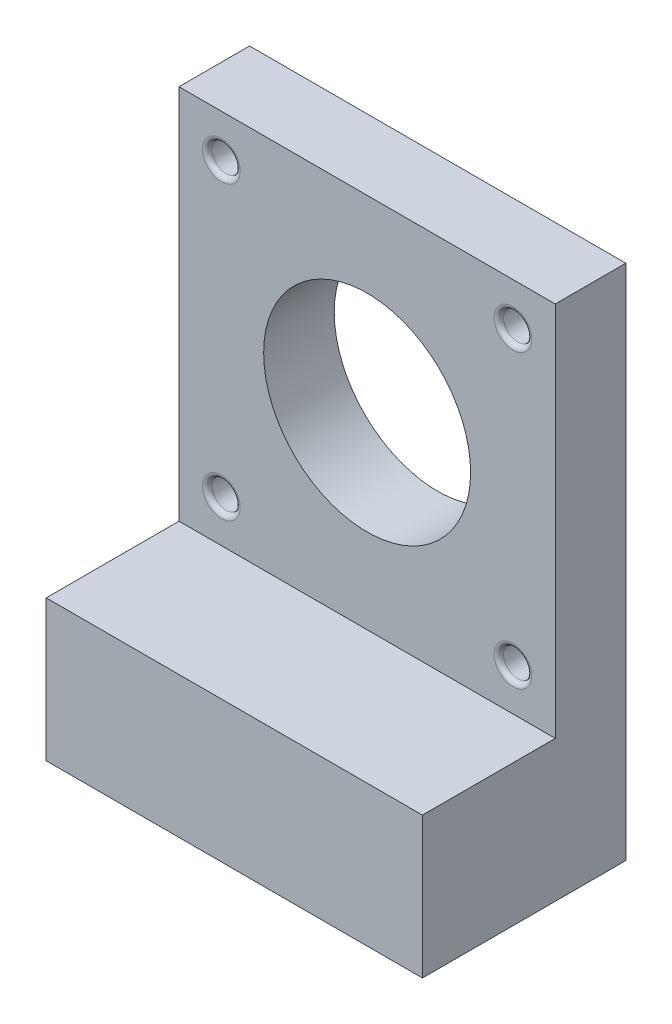
ISO-10303-21;
HEADER;
FILE_DESCRIPTION(('STEP AP214'),'2;1');
FILE_NAME('part.step','',(''),(''),'','','');
FILE_SCHEMA(('AUTOMOTIVE_DESIGN { 1 0 10303 214 1 1 1 1 }'));
ENDSEC;
DATA;
#1=APPLICATION_CONTEXT('core data for automotive mechanical design processes');
#2=APPLICATION_PROTOCOL_DEFINITION('international standard','automotive_design',2000,#1);
#3=PRODUCT_CONTEXT('',#1,'mechanical');
#4=PRODUCT('Part','Part','',(#3));
#5=PRODUCT_RELATED_PRODUCT_CATEGORY('part','',(#4));
#6=PRODUCT_DEFINITION_FORMATION('','',#4);
#7=PRODUCT_DEFINITION_CONTEXT('part definition',#1,'design');
#8=PRODUCT_DEFINITION('design','',#6,#7);
#9=PRODUCT_DEFINITION_SHAPE('','',#8);
#10=(LENGTH_UNIT() NAMED_UNIT(*) SI_UNIT(.MILLI.,.METRE.));
#11=(NAMED_UNIT(*) PLANE_ANGLE_UNIT() SI_UNIT($,.RADIAN.));
#12=(NAMED_UNIT(*) SI_UNIT($,.STERADIAN.) SOLID_ANGLE_UNIT());
#13=UNCERTAINTY_MEASURE_WITH_UNIT(LENGTH_MEASURE(1.E-05),#10,'distance_accuracy_value','');
#14=(GEOMETRIC_REPRESENTATION_CONTEXT(3) GLOBAL_UNCERTAINTY_ASSIGNED_CONTEXT((#13)) GLOBAL_UNIT_ASSIGNED_CONTEXT((#10,
#11,#12)) REPRESENTATION_CONTEXT('',''));
#15=CARTESIAN_POINT('',(0.,0.,0.));
#16=DIRECTION('',(0.,0.,1.));
#17=DIRECTION('',(1.,0.,0.));
#18=AXIS2_PLACEMENT_3D('',#15,#16,#17);
#19=CARTESIAN_POINT('',(0.,0.,7.5));
#20=DIRECTION('',(0.,0.,1.));
#21=DIRECTION('',(1.,0.,0.));
#22=AXIS2_PLACEMENT_3D('',#19,#20,#21);
#23=PLANE('',#22);
#24=CARTESIAN_POINT('',(15.5,-5.5,7.5));
#25=DIRECTION('',(0.,0.,1.));
#26=DIRECTION('',(1.,0.,0.));
#27=AXIS2_PLACEMENT_3D('',#24,#25,#26);
#28=CIRCLE('',#27,2.);
#29=CARTESIAN_POINT('',(17.5,-5.5,7.5));
#30=VERTEX_POINT('',#29);
#31=EDGE_CURVE('E205',#30,#30,#28,.F.);
#32=ORIENTED_EDGE('',*,*,#31,.T.);
#33=EDGE_LOOP('',(#32));
#34=FACE_BOUND('',#33,.T.);
#35=CARTESIAN_POINT('',(-15.5,-5.5,7.5));
#36=DIRECTION('',(0.,0.,1.));
#37=DIRECTION('',(1.,0.,0.));
#38=AXIS2_PLACEMENT_3D('',#35,#36,#37);
#39=CIRCLE('',#38,2.);
#40=CARTESIAN_POINT('',(-13.5,-5.5,7.5));
#41=VERTEX_POINT('',#40);
#42=EDGE_CURVE('E201',#41,#41,#39,.F.);
#43=ORIENTED_EDGE('',*,*,#42,.T.);
#44=EDGE_LOOP('',(#43));
#45=FACE_BOUND('',#44,.T.);
#46=CARTESIAN_POINT('',(-15.5,25.5,7.5));
#47=DIRECTION('',(0.,0.,1.));
#48=DIRECTION('',(1.,0.,0.));
#49=AXIS2_PLACEMENT_3D('',#46,#47,#48);
#50=CIRCLE('',#49,2.);
#51=CARTESIAN_POINT('',(-13.5,25.5,7.5));
#52=VERTEX_POINT('',#51);
#53=EDGE_CURVE('E197',#52,#52,#50,.F.);
#54=ORIENTED_EDGE('',*,*,#53,.T.);
#55=EDGE_LOOP('',(#54));
#56=FACE_BOUND('',#55,.T.);
#57=CARTESIAN_POINT('',(15.5,25.5,7.5));
#58=DIRECTION('',(0.,0.,1.));
#59=DIRECTION('',(1.,0.,0.));
#60=AXIS2_PLACEMENT_3D('',#57,#58,#59);
#61=CIRCLE('',#60,2.);
#62=CARTESIAN_POINT('',(17.5,25.5,7.5));
#63=VERTEX_POINT('',#62);
#64=EDGE_CURVE('E193',#63,#63,#61,.F.);
#65=ORIENTED_EDGE('',*,*,#64,.T.);
#66=EDGE_LOOP('',(#65));
#67=FACE_BOUND('',#66,.T.);
#68=DIRECTION('',(-1.,0.,0.));
#69=VECTOR('',#68,1.);
#70=CARTESIAN_POINT('',(-20.,-10.,7.5));
#71=LINE('',#70,#69);
#72=CARTESIAN_POINT('',(20.,-10.,7.5));
#73=VERTEX_POINT('',#72);
#74=CARTESIAN_POINT('',(-20.,-10.,7.5));
#75=VERTEX_POINT('',#74);
#76=EDGE_CURVE('E66',#73,#75,#71,.T.);
#77=ORIENTED_EDGE('',*,*,#76,.F.);
#78=DIRECTION('',(0.,1.,0.));
#79=VECTOR('',#78,1.);
#80=CARTESIAN_POINT('',(20.,-30.,7.5));
#81=LINE('',#80,#79);
#82=CARTESIAN_POINT('',(20.,30.,7.5));
#83=VERTEX_POINT('',#82);
#84=EDGE_CURVE('E148',#73,#83,#81,.T.);
#85=ORIENTED_EDGE('',*,*,#84,.T.);
#86=DIRECTION('',(-1.,0.,0.));
#87=VECTOR('',#86,1.);
#88=CARTESIAN_POINT('',(20.,30.,7.5));
#89=LINE('',#88,#87);
#90=CARTESIAN_POINT('',(-20.,30.,7.5));
#91=VERTEX_POINT('',#90);
#92=EDGE_CURVE('E152',#83,#91,#89,.T.);
#93=ORIENTED_EDGE('',*,*,#92,.T.);
#94=DIRECTION('',(0.,-1.,0.));
#95=VECTOR('',#94,1.);
#96=CARTESIAN_POINT('',(-20.,-30.,7.5));
#97=LINE('',#96,#95);
#98=EDGE_CURVE('E145',#91,#75,#97,.T.);
#99=ORIENTED_EDGE('',*,*,#98,.T.);
#100=EDGE_LOOP('',(#77,#85,#93,#99));
#101=FACE_BOUND('',#100,.T.);
#102=CARTESIAN_POINT('',(0.,10.,7.5));
#103=DIRECTION('',(0.,0.,1.));
#104=DIRECTION('',(1.,0.,0.));
#105=AXIS2_PLACEMENT_3D('',#102,#103,#104);
#106=CIRCLE('',#105,11.);
#107=CARTESIAN_POINT('',(11.,10.,7.5));
#108=VERTEX_POINT('',#107);
#109=EDGE_CURVE('E138',#108,#108,#106,.T.);
#110=ORIENTED_EDGE('',*,*,#109,.F.);
#111=EDGE_LOOP('',(#110));
#112=FACE_BOUND('',#111,.T.);
#113=ADVANCED_FACE('F42',(#34,#45,#56,#67,#101,#112),#23,.T.);
#114=CARTESIAN_POINT('',(0.,0.,0.));
#115=DIRECTION('',(0.,0.,1.));
#116=DIRECTION('',(1.,0.,0.));
#117=AXIS2_PLACEMENT_3D('',#114,#115,#116);
#118=PLANE('',#117);
#119=CARTESIAN_POINT('',(15.5,-5.5,0.));
#120=DIRECTION('',(0.,0.,1.));
#121=DIRECTION('',(1.,0.,0.));
#122=AXIS2_PLACEMENT_3D('',#119,#120,#121);
#123=CIRCLE('',#122,2.);
#124=CARTESIAN_POINT('',(17.5,-5.5,0.));
#125=VERTEX_POINT('',#124);
#126=EDGE_CURVE('E189',#125,#125,#123,.T.);
#127=ORIENTED_EDGE('',*,*,#126,.T.);
#128=EDGE_LOOP('',(#127));
#129=FACE_BOUND('',#128,.T.);
#130=CARTESIAN_POINT('',(-15.5,-5.5,0.));
#131=DIRECTION('',(0.,0.,1.));
#132=DIRECTION('',(1.,0.,0.));
#133=AXIS2_PLACEMENT_3D('',#130,#131,#132);
#134=CIRCLE('',#133,2.);
#135=CARTESIAN_POINT('',(-13.5,-5.5,0.));
#136=VERTEX_POINT('',#135);
#137=EDGE_CURVE('E185',#136,#136,#134,.T.);
#138=ORIENTED_EDGE('',*,*,#137,.T.);
#139=EDGE_LOOP('',(#138));
#140=FACE_BOUND('',#139,.T.);
#141=CARTESIAN_POINT('',(-15.5,25.5,0.));
#142=DIRECTION('',(0.,0.,1.));
#143=DIRECTION('',(1.,0.,0.));
#144=AXIS2_PLACEMENT_3D('',#141,#142,#143);
#145=CIRCLE('',#144,2.);
#146=CARTESIAN_POINT('',(-13.5,25.5,0.));
#147=VERTEX_POINT('',#146);
#148=EDGE_CURVE('E181',#147,#147,#145,.T.);
#149=ORIENTED_EDGE('',*,*,#148,.T.);
#150=EDGE_LOOP('',(#149));
#151=FACE_BOUND('',#150,.T.);
#152=CARTESIAN_POINT('',(15.5,25.5,0.));
#153=DIRECTION('',(0.,0.,1.));
#154=DIRECTION('',(1.,0.,0.));
#155=AXIS2_PLACEMENT_3D('',#152,#153,#154);
#156=CIRCLE('',#155,2.);
#157=CARTESIAN_POINT('',(17.5,25.5,0.));
#158=VERTEX_POINT('',#157);
#159=EDGE_CURVE('E177',#158,#158,#156,.T.);
#160=ORIENTED_EDGE('',*,*,#159,.T.);
#161=EDGE_LOOP('',(#160));
#162=FACE_BOUND('',#161,.T.);
#163=DIRECTION('',(0.,1.,0.));
#164=VECTOR('',#163,1.);
#165=CARTESIAN_POINT('',(20.,-30.,0.));
#166=LINE('',#165,#164);
#167=CARTESIAN_POINT('',(20.,-25.,0.));
#168=VERTEX_POINT('',#167);
#169=CARTESIAN_POINT('',(20.,30.,0.));
#170=VERTEX_POINT('',#169);
#171=EDGE_CURVE('E158',#168,#170,#166,.T.);
#172=ORIENTED_EDGE('',*,*,#171,.F.);
#173=DIRECTION('',(1.,0.,0.));
#174=VECTOR('',#173,1.);
#175=CARTESIAN_POINT('',(-20.,-25.,0.));
#176=LINE('',#175,#174);
#177=CARTESIAN_POINT('',(-20.,-25.,0.));
#178=VERTEX_POINT('',#177);
#179=EDGE_CURVE('E102',#178,#168,#176,.T.);
#180=ORIENTED_EDGE('',*,*,#179,.F.);
#181=DIRECTION('',(0.,-1.,0.));
#182=VECTOR('',#181,1.);
#183=CARTESIAN_POINT('',(-20.,-30.,0.));
#184=LINE('',#183,#182);
#185=CARTESIAN_POINT('',(-20.,30.,0.));
#186=VERTEX_POINT('',#185);
#187=EDGE_CURVE('E112',#186,#178,#184,.T.);
#188=ORIENTED_EDGE('',*,*,#187,.F.);
#189=DIRECTION('',(-1.,0.,0.));
#190=VECTOR('',#189,1.);
#191=CARTESIAN_POINT('',(20.,30.,0.));
#192=LINE('',#191,#190);
#193=EDGE_CURVE('E149',#170,#186,#192,.T.);
#194=ORIENTED_EDGE('',*,*,#193,.F.);
#195=EDGE_LOOP('',(#172,#180,#188,#194));
#196=FACE_BOUND('',#195,.T.);
#197=CARTESIAN_POINT('',(0.,10.,0.));
#198=DIRECTION('',(0.,0.,1.));
#199=DIRECTION('',(1.,0.,0.));
#200=AXIS2_PLACEMENT_3D('',#197,#198,#199);
#201=CIRCLE('',#200,11.);
#202=CARTESIAN_POINT('',(11.,10.,0.));
#203=VERTEX_POINT('',#202);
#204=EDGE_CURVE('E137',#203,#203,#201,.T.);
#205=ORIENTED_EDGE('',*,*,#204,.T.);
#206=EDGE_LOOP('',(#205));
#207=FACE_BOUND('',#206,.T.);
#208=ADVANCED_FACE('F242',(#129,#140,#151,#162,#196,#207),#118,.F.);
#209=CARTESIAN_POINT('',(-20.,-30.,7.5));
#210=DIRECTION('',(1.,0.,0.));
#211=DIRECTION('',(0.,0.,-1.));
#212=AXIS2_PLACEMENT_3D('',#209,#210,#211);
#213=PLANE('',#212);
#214=ORIENTED_EDGE('',*,*,#187,.T.);
#215=DIRECTION('',(0.,0.,-1.));
#216=VECTOR('',#215,1.);
#217=CARTESIAN_POINT('',(-20.,-25.,21.62));
#218=LINE('',#217,#216);
#219=CARTESIAN_POINT('',(-20.,-25.,21.62));
#220=VERTEX_POINT('',#219);
#221=EDGE_CURVE('E96',#220,#178,#218,.T.);
#222=ORIENTED_EDGE('',*,*,#221,.F.);
#223=DIRECTION('',(0.,-1.,0.));
#224=VECTOR('',#223,1.);
#225=CARTESIAN_POINT('',(-20.,-30.,21.62));
#226=LINE('',#225,#224);
#227=CARTESIAN_POINT('',(-20.,-10.,21.62));
#228=VERTEX_POINT('',#227);
#229=EDGE_CURVE('E109',#228,#220,#226,.T.);
#230=ORIENTED_EDGE('',*,*,#229,.F.);
#231=DIRECTION('',(0.,0.,-1.));
#232=VECTOR('',#231,1.);
#233=CARTESIAN_POINT('',(-20.,-10.,21.62));
#234=LINE('',#233,#232);
#235=EDGE_CURVE('E129',#228,#75,#234,.T.);
#236=ORIENTED_EDGE('',*,*,#235,.T.);
#237=ORIENTED_EDGE('',*,*,#98,.F.);
#238=DIRECTION('',(0.,0.,-1.));
#239=VECTOR('',#238,1.);
#240=CARTESIAN_POINT('',(-20.,30.,7.5));
#241=LINE('',#240,#239);
#242=EDGE_CURVE('E155',#91,#186,#241,.T.);
#243=ORIENTED_EDGE('',*,*,#242,.T.);
#244=EDGE_LOOP('',(#214,#222,#230,#236,#237,#243));
#245=FACE_BOUND('',#244,.T.);
#246=ADVANCED_FACE('F107',(#245),#213,.F.);
#247=CARTESIAN_POINT('',(20.,-30.,7.5));
#248=DIRECTION('',(-1.,0.,0.));
#249=DIRECTION('',(0.,0.,1.));
#250=AXIS2_PLACEMENT_3D('',#247,#248,#249);
#251=PLANE('',#250);
#252=DIRECTION('',(0.,1.,0.));
#253=VECTOR('',#252,1.);
#254=CARTESIAN_POINT('',(20.,-30.,21.62));
#255=LINE('',#254,#253);
#256=CARTESIAN_POINT('',(20.,-25.,21.62));
#257=VERTEX_POINT('',#256);
#258=CARTESIAN_POINT('',(20.,-10.,21.62));
#259=VERTEX_POINT('',#258);
#260=EDGE_CURVE('E120',#257,#259,#255,.T.);
#261=ORIENTED_EDGE('',*,*,#260,.F.);
#262=DIRECTION('',(0.,0.,-1.));
#263=VECTOR('',#262,1.);
#264=CARTESIAN_POINT('',(20.,-25.,21.62));
#265=LINE('',#264,#263);
#266=EDGE_CURVE('E58',#257,#168,#265,.T.);
#267=ORIENTED_EDGE('',*,*,#266,.T.);
#268=ORIENTED_EDGE('',*,*,#171,.T.);
#269=DIRECTION('',(0.,0.,-1.));
#270=VECTOR('',#269,1.);
#271=CARTESIAN_POINT('',(20.,30.,7.5));
#272=LINE('',#271,#270);
#273=EDGE_CURVE('E165',#83,#170,#272,.T.);
#274=ORIENTED_EDGE('',*,*,#273,.F.);
#275=ORIENTED_EDGE('',*,*,#84,.F.);
#276=DIRECTION('',(0.,0.,-1.));
#277=VECTOR('',#276,1.);
#278=CARTESIAN_POINT('',(20.,-10.,21.62));
#279=LINE('',#278,#277);
#280=EDGE_CURVE('E133',#259,#73,#279,.T.);
#281=ORIENTED_EDGE('',*,*,#280,.F.);
#282=EDGE_LOOP('',(#261,#267,#268,#274,#275,#281));
#283=FACE_BOUND('',#282,.T.);
#284=ADVANCED_FACE('F258',(#283),#251,.F.);
#285=CARTESIAN_POINT('',(20.,30.,7.5));
#286=DIRECTION('',(0.,-1.,0.));
#287=DIRECTION('',(0.,0.,-1.));
#288=AXIS2_PLACEMENT_3D('',#285,#286,#287);
#289=PLANE('',#288);
#290=ORIENTED_EDGE('',*,*,#193,.T.);
#291=ORIENTED_EDGE('',*,*,#242,.F.);
#292=ORIENTED_EDGE('',*,*,#92,.F.);
#293=ORIENTED_EDGE('',*,*,#273,.T.);
#294=EDGE_LOOP('',(#290,#291,#292,#293));
#295=FACE_BOUND('',#294,.T.);
#296=ADVANCED_FACE('F255',(#295),#289,.F.);
#297=CARTESIAN_POINT('',(0.,10.,7.5));
#298=DIRECTION('',(0.,0.,-1.));
#299=DIRECTION('',(-1.,0.,0.));
#300=AXIS2_PLACEMENT_3D('',#297,#298,#299);
#301=CYLINDRICAL_SURFACE('',#300,11.);
#302=ORIENTED_EDGE('',*,*,#109,.T.);
#303=EDGE_LOOP('',(#302));
#304=FACE_BOUND('',#303,.T.);
#305=ORIENTED_EDGE('',*,*,#204,.F.);
#306=EDGE_LOOP('',(#305));
#307=FACE_BOUND('',#306,.T.);
#308=ADVANCED_FACE('F252',(#304,#307),#301,.F.);
#309=CARTESIAN_POINT('',(-20.,-10.,21.62));
#310=DIRECTION('',(0.,-1.,0.));
#311=DIRECTION('',(0.,0.,-1.));
#312=AXIS2_PLACEMENT_3D('',#309,#310,#311);
#313=PLANE('',#312);
#314=ORIENTED_EDGE('',*,*,#76,.T.);
#315=ORIENTED_EDGE('',*,*,#235,.F.);
#316=DIRECTION('',(-1.,0.,0.));
#317=VECTOR('',#316,1.);
#318=CARTESIAN_POINT('',(-20.,-10.,21.62));
#319=LINE('',#318,#317);
#320=EDGE_CURVE('E117',#259,#228,#319,.T.);
#321=ORIENTED_EDGE('',*,*,#320,.F.);
#322=ORIENTED_EDGE('',*,*,#280,.T.);
#323=EDGE_LOOP('',(#314,#315,#321,#322));
#324=FACE_BOUND('',#323,.T.);
#325=ADVANCED_FACE('F312',(#324),#313,.F.);
#326=CARTESIAN_POINT('',(0.,0.,21.62));
#327=DIRECTION('',(0.,0.,-1.));
#328=DIRECTION('',(-1.,0.,0.));
#329=AXIS2_PLACEMENT_3D('',#326,#327,#328);
#330=PLANE('',#329);
#331=ORIENTED_EDGE('',*,*,#229,.T.);
#332=DIRECTION('',(1.,0.,0.));
#333=VECTOR('',#332,1.);
#334=CARTESIAN_POINT('',(-20.,-25.,21.62));
#335=LINE('',#334,#333);
#336=EDGE_CURVE('E93',#220,#257,#335,.T.);
#337=ORIENTED_EDGE('',*,*,#336,.T.);
#338=ORIENTED_EDGE('',*,*,#260,.T.);
#339=ORIENTED_EDGE('',*,*,#320,.T.);
#340=EDGE_LOOP('',(#331,#337,#338,#339));
#341=FACE_BOUND('',#340,.T.);
#342=ADVANCED_FACE('F115',(#341),#330,.F.);
#343=CARTESIAN_POINT('',(15.5,25.5,21.62));
#344=DIRECTION('',(0.,0.,-1.));
#345=DIRECTION('',(-1.,0.,0.));
#346=AXIS2_PLACEMENT_3D('',#343,#344,#345);
#347=CYLINDRICAL_SURFACE('',#346,1.5);
#348=CARTESIAN_POINT('',(15.5,25.5,0.5));
#349=DIRECTION('',(0.,0.,1.));
#350=DIRECTION('',(1.,0.,0.));
#351=AXIS2_PLACEMENT_3D('',#348,#349,#350);
#352=CIRCLE('',#351,1.5);
#353=CARTESIAN_POINT('',(17.,25.5,0.5));
#354=VERTEX_POINT('',#353);
#355=EDGE_CURVE('E11',#354,#354,#352,.F.);
#356=ORIENTED_EDGE('',*,*,#355,.T.);
#357=EDGE_LOOP('',(#356));
#358=FACE_BOUND('',#357,.T.);
#359=CARTESIAN_POINT('',(15.5,25.5,7.));
#360=DIRECTION('',(0.,0.,1.));
#361=DIRECTION('',(1.,0.,0.));
#362=AXIS2_PLACEMENT_3D('',#359,#360,#361);
#363=CIRCLE('',#362,1.5);
#364=CARTESIAN_POINT('',(17.,25.5,7.));
#365=VERTEX_POINT('',#364);
#366=EDGE_CURVE('E51',#365,#365,#363,.T.);
#367=ORIENTED_EDGE('',*,*,#366,.T.);
#368=EDGE_LOOP('',(#367));
#369=FACE_BOUND('',#368,.T.);
#370=ADVANCED_FACE('F228',(#358,#369),#347,.F.);
#371=CARTESIAN_POINT('',(-15.5,25.5,21.62));
#372=DIRECTION('',(0.,0.,-1.));
#373=DIRECTION('',(-1.,0.,0.));
#374=AXIS2_PLACEMENT_3D('',#371,#372,#373);
#375=CYLINDRICAL_SURFACE('',#374,1.5);
#376=CARTESIAN_POINT('',(-15.5,25.5,0.5));
#377=DIRECTION('',(0.,0.,1.));
#378=DIRECTION('',(1.,0.,0.));
#379=AXIS2_PLACEMENT_3D('',#376,#377,#378);
#380=CIRCLE('',#379,1.5);
#381=CARTESIAN_POINT('',(-14.,25.5,0.5));
#382=VERTEX_POINT('',#381);
#383=EDGE_CURVE('E221',#382,#382,#380,.F.);
#384=ORIENTED_EDGE('',*,*,#383,.T.);
#385=EDGE_LOOP('',(#384));
#386=FACE_BOUND('',#385,.T.);
#387=CARTESIAN_POINT('',(-15.5,25.5,7.));
#388=DIRECTION('',(0.,0.,1.));
#389=DIRECTION('',(1.,0.,0.));
#390=AXIS2_PLACEMENT_3D('',#387,#388,#389);
#391=CIRCLE('',#390,1.5);
#392=CARTESIAN_POINT('',(-14.,25.5,7.));
#393=VERTEX_POINT('',#392);
#394=EDGE_CURVE('E217',#393,#393,#391,.T.);
#395=ORIENTED_EDGE('',*,*,#394,.T.);
#396=EDGE_LOOP('',(#395));
#397=FACE_BOUND('',#396,.T.);
#398=ADVANCED_FACE('F294',(#386,#397),#375,.F.);
#399=CARTESIAN_POINT('',(-15.5,-5.5,21.62));
#400=DIRECTION('',(0.,0.,-1.));
#401=DIRECTION('',(-1.,0.,0.));
#402=AXIS2_PLACEMENT_3D('',#399,#400,#401);
#403=CYLINDRICAL_SURFACE('',#402,1.5);
#404=CARTESIAN_POINT('',(-15.5,-5.5,0.5));
#405=DIRECTION('',(0.,0.,1.));
#406=DIRECTION('',(1.,0.,0.));
#407=AXIS2_PLACEMENT_3D('',#404,#405,#406);
#408=CIRCLE('',#407,1.5);
#409=CARTESIAN_POINT('',(-14.,-5.5,0.5));
#410=VERTEX_POINT('',#409);
#411=EDGE_CURVE('E213',#410,#410,#408,.F.);
#412=ORIENTED_EDGE('',*,*,#411,.T.);
#413=EDGE_LOOP('',(#412));
#414=FACE_BOUND('',#413,.T.);
#415=CARTESIAN_POINT('',(-15.5,-5.5,7.));
#416=DIRECTION('',(0.,0.,1.));
#417=DIRECTION('',(1.,0.,0.));
#418=AXIS2_PLACEMENT_3D('',#415,#416,#417);
#419=CIRCLE('',#418,1.5);
#420=CARTESIAN_POINT('',(-14.,-5.5,7.));
#421=VERTEX_POINT('',#420);
#422=EDGE_CURVE('E209',#421,#421,#419,.T.);
#423=ORIENTED_EDGE('',*,*,#422,.T.);
#424=EDGE_LOOP('',(#423));
#425=FACE_BOUND('',#424,.T.);
#426=ADVANCED_FACE('F296',(#414,#425),#403,.F.);
#427=CARTESIAN_POINT('',(15.5,-5.5,21.62));
#428=DIRECTION('',(0.,0.,-1.));
#429=DIRECTION('',(-1.,0.,0.));
#430=AXIS2_PLACEMENT_3D('',#427,#428,#429);
#431=CYLINDRICAL_SURFACE('',#430,1.5);
#432=CARTESIAN_POINT('',(15.5,-5.5,0.5));
#433=DIRECTION('',(0.,0.,1.));
#434=DIRECTION('',(1.,0.,0.));
#435=AXIS2_PLACEMENT_3D('',#432,#433,#434);
#436=CIRCLE('',#435,1.5);
#437=CARTESIAN_POINT('',(17.,-5.5,0.5));
#438=VERTEX_POINT('',#437);
#439=EDGE_CURVE('E173',#438,#438,#436,.F.);
#440=ORIENTED_EDGE('',*,*,#439,.T.);
#441=EDGE_LOOP('',(#440));
#442=FACE_BOUND('',#441,.T.);
#443=CARTESIAN_POINT('',(15.5,-5.5,7.));
#444=DIRECTION('',(0.,0.,1.));
#445=DIRECTION('',(1.,0.,0.));
#446=AXIS2_PLACEMENT_3D('',#443,#444,#445);
#447=CIRCLE('',#446,1.5);
#448=CARTESIAN_POINT('',(17.,-5.5,7.));
#449=VERTEX_POINT('',#448);
#450=EDGE_CURVE('E169',#449,#449,#447,.T.);
#451=ORIENTED_EDGE('',*,*,#450,.T.);
#452=EDGE_LOOP('',(#451));
#453=FACE_BOUND('',#452,.T.);
#454=ADVANCED_FACE('F269',(#442,#453),#431,.F.);
#455=CARTESIAN_POINT('',(15.5,-5.5,0.5));
#456=DIRECTION('',(0.,0.,1.));
#457=DIRECTION('',(1.,0.,0.));
#458=AXIS2_PLACEMENT_3D('',#455,#456,#457);
#459=TOROIDAL_SURFACE('',#458,2.,0.5);
#460=ORIENTED_EDGE('',*,*,#126,.F.);
#461=EDGE_LOOP('',(#460));
#462=FACE_BOUND('',#461,.T.);
#463=ORIENTED_EDGE('',*,*,#439,.F.);
#464=EDGE_LOOP('',(#463));
#465=FACE_BOUND('',#464,.T.);
#466=ADVANCED_FACE('F265',(#462,#465),#459,.T.);
#467=CARTESIAN_POINT('',(15.5,-5.5,7.));
#468=DIRECTION('',(0.,0.,1.));
#469=DIRECTION('',(1.,0.,0.));
#470=AXIS2_PLACEMENT_3D('',#467,#468,#469);
#471=TOROIDAL_SURFACE('',#470,2.,0.5);
#472=ORIENTED_EDGE('',*,*,#31,.F.);
#473=EDGE_LOOP('',(#472));
#474=FACE_BOUND('',#473,.T.);
#475=ORIENTED_EDGE('',*,*,#450,.F.);
#476=EDGE_LOOP('',(#475));
#477=FACE_BOUND('',#476,.T.);
#478=ADVANCED_FACE('F268',(#474,#477),#471,.T.);
#479=CARTESIAN_POINT('',(-15.5,-5.5,0.5));
#480=DIRECTION('',(0.,0.,1.));
#481=DIRECTION('',(1.,0.,0.));
#482=AXIS2_PLACEMENT_3D('',#479,#480,#481);
#483=TOROIDAL_SURFACE('',#482,2.,0.5);
#484=ORIENTED_EDGE('',*,*,#137,.F.);
#485=EDGE_LOOP('',(#484));
#486=FACE_BOUND('',#485,.T.);
#487=ORIENTED_EDGE('',*,*,#411,.F.);
#488=EDGE_LOOP('',(#487));
#489=FACE_BOUND('',#488,.T.);
#490=ADVANCED_FACE('F273',(#486,#489),#483,.T.);
#491=CARTESIAN_POINT('',(-15.5,-5.5,7.));
#492=DIRECTION('',(0.,0.,1.));
#493=DIRECTION('',(1.,0.,0.));
#494=AXIS2_PLACEMENT_3D('',#491,#492,#493);
#495=TOROIDAL_SURFACE('',#494,2.,0.5);
#496=ORIENTED_EDGE('',*,*,#42,.F.);
#497=EDGE_LOOP('',(#496));
#498=FACE_BOUND('',#497,.T.);
#499=ORIENTED_EDGE('',*,*,#422,.F.);
#500=EDGE_LOOP('',(#499));
#501=FACE_BOUND('',#500,.T.);
#502=ADVANCED_FACE('F277',(#498,#501),#495,.T.);
#503=CARTESIAN_POINT('',(-15.5,25.5,0.5));
#504=DIRECTION('',(0.,0.,1.));
#505=DIRECTION('',(1.,0.,0.));
#506=AXIS2_PLACEMENT_3D('',#503,#504,#505);
#507=TOROIDAL_SURFACE('',#506,2.,0.5);
#508=ORIENTED_EDGE('',*,*,#148,.F.);
#509=EDGE_LOOP('',(#508));
#510=FACE_BOUND('',#509,.T.);
#511=ORIENTED_EDGE('',*,*,#383,.F.);
#512=EDGE_LOOP('',(#511));
#513=FACE_BOUND('',#512,.T.);
#514=ADVANCED_FACE('F281',(#510,#513),#507,.T.);
#515=CARTESIAN_POINT('',(-15.5,25.5,7.));
#516=DIRECTION('',(0.,0.,1.));
#517=DIRECTION('',(1.,0.,0.));
#518=AXIS2_PLACEMENT_3D('',#515,#516,#517);
#519=TOROIDAL_SURFACE('',#518,2.,0.5);
#520=ORIENTED_EDGE('',*,*,#53,.F.);
#521=EDGE_LOOP('',(#520));
#522=FACE_BOUND('',#521,.T.);
#523=ORIENTED_EDGE('',*,*,#394,.F.);
#524=EDGE_LOOP('',(#523));
#525=FACE_BOUND('',#524,.T.);
#526=ADVANCED_FACE('F238',(#522,#525),#519,.T.);
#527=CARTESIAN_POINT('',(15.5,25.5,0.5));
#528=DIRECTION('',(0.,0.,1.));
#529=DIRECTION('',(1.,0.,0.));
#530=AXIS2_PLACEMENT_3D('',#527,#528,#529);
#531=TOROIDAL_SURFACE('',#530,2.,0.5);
#532=ORIENTED_EDGE('',*,*,#159,.F.);
#533=EDGE_LOOP('',(#532));
#534=FACE_BOUND('',#533,.T.);
#535=ORIENTED_EDGE('',*,*,#355,.F.);
#536=EDGE_LOOP('',(#535));
#537=FACE_BOUND('',#536,.T.);
#538=ADVANCED_FACE('F231',(#534,#537),#531,.T.);
#539=CARTESIAN_POINT('',(15.5,25.5,7.));
#540=DIRECTION('',(0.,0.,1.));
#541=DIRECTION('',(1.,0.,0.));
#542=AXIS2_PLACEMENT_3D('',#539,#540,#541);
#543=TOROIDAL_SURFACE('',#542,2.,0.5);
#544=ORIENTED_EDGE('',*,*,#64,.F.);
#545=EDGE_LOOP('',(#544));
#546=FACE_BOUND('',#545,.T.);
#547=ORIENTED_EDGE('',*,*,#366,.F.);
#548=EDGE_LOOP('',(#547));
#549=FACE_BOUND('',#548,.T.);
#550=ADVANCED_FACE('F44',(#546,#549),#543,.T.);
#551=CARTESIAN_POINT('',(-20.,-25.,21.62));
#552=DIRECTION('',(0.,1.,0.));
#553=DIRECTION('',(-1.,0.,0.));
#554=AXIS2_PLACEMENT_3D('',#551,#552,#553);
#555=PLANE('',#554);
#556=ORIENTED_EDGE('',*,*,#179,.T.);
#557=ORIENTED_EDGE('',*,*,#266,.F.);
#558=ORIENTED_EDGE('',*,*,#336,.F.);
#559=ORIENTED_EDGE('',*,*,#221,.T.);
#560=EDGE_LOOP('',(#556,#557,#558,#559));
#561=FACE_BOUND('',#560,.T.);
#562=ADVANCED_FACE('F95',(#561),#555,.F.);
#563=CLOSED_SHELL('',(#113,#208,#246,#284,#296,#308,#325,#342,#370,#398,#426,#454,#466,#478,
#490,#502,#514,#526,#538,#550,#562));
#564=MANIFOLD_SOLID_BREP('B2',#563);
#565=ADVANCED_BREP_SHAPE_REPRESENTATION('',(#18,#564),#14);
#566=SHAPE_DEFINITION_REPRESENTATION(#9,#565);
ENDSEC;
END-ISO-10303-21;
